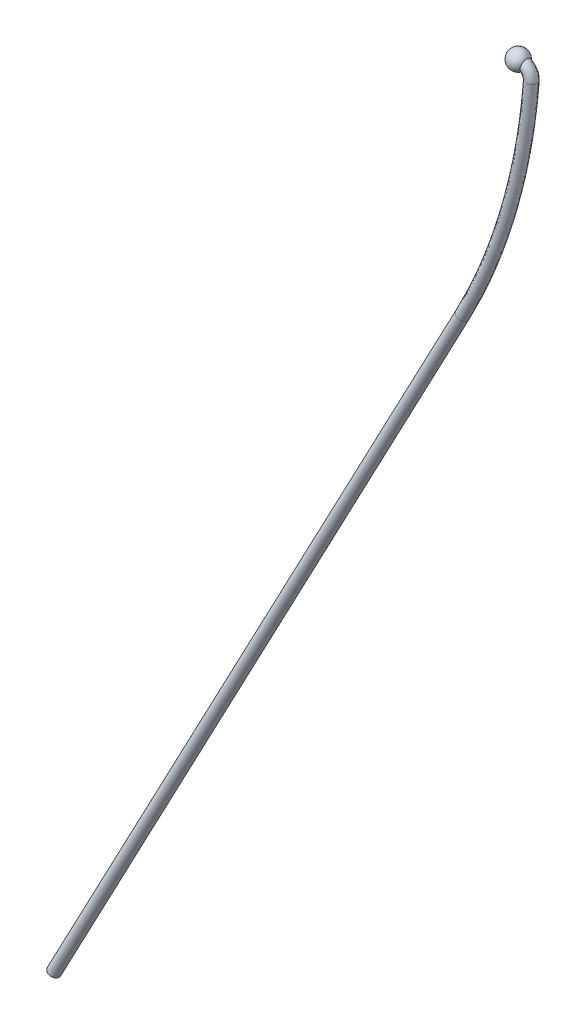
ISO-10303-21;
HEADER;
FILE_DESCRIPTION(('STEP AP214'),'2;1');
FILE_NAME('part.step','',(''),(''),'','','');
FILE_SCHEMA(('AUTOMOTIVE_DESIGN { 1 0 10303 214 1 1 1 1 }'));
ENDSEC;
DATA;
#1=APPLICATION_CONTEXT('core data for automotive mechanical design processes');
#2=APPLICATION_PROTOCOL_DEFINITION('international standard','automotive_design',2000,#1);
#3=PRODUCT_CONTEXT('',#1,'mechanical');
#4=PRODUCT('Part','Part','',(#3));
#5=PRODUCT_RELATED_PRODUCT_CATEGORY('part','',(#4));
#6=PRODUCT_DEFINITION_FORMATION('','',#4);
#7=PRODUCT_DEFINITION_CONTEXT('part definition',#1,'design');
#8=PRODUCT_DEFINITION('design','',#6,#7);
#9=PRODUCT_DEFINITION_SHAPE('','',#8);
#10=(LENGTH_UNIT() NAMED_UNIT(*) SI_UNIT(.MILLI.,.METRE.));
#11=(NAMED_UNIT(*) PLANE_ANGLE_UNIT() SI_UNIT($,.RADIAN.));
#12=(NAMED_UNIT(*) SI_UNIT($,.STERADIAN.) SOLID_ANGLE_UNIT());
#13=UNCERTAINTY_MEASURE_WITH_UNIT(LENGTH_MEASURE(1.E-05),#10,'distance_accuracy_value','');
#14=(GEOMETRIC_REPRESENTATION_CONTEXT(3) GLOBAL_UNCERTAINTY_ASSIGNED_CONTEXT((#13)) GLOBAL_UNIT_ASSIGNED_CONTEXT((#10,
#11,#12)) REPRESENTATION_CONTEXT('',''));
#15=CARTESIAN_POINT('',(0.,0.,0.));
#16=DIRECTION('',(0.,0.,1.));
#17=DIRECTION('',(1.,0.,0.));
#18=AXIS2_PLACEMENT_3D('',#15,#16,#17);
#19=CARTESIAN_POINT('',(0.05,0.,-0.15));
#20=CARTESIAN_POINT('',(0.070612126372054,0.,-0.15));
#21=CARTESIAN_POINT('',(0.111678763808335,-0.00475035948913755,-0.15));
#22=CARTESIAN_POINT('',(0.175583795185796,-0.025625995231415,-0.15));
#23=CARTESIAN_POINT('',(0.23587135332701,-0.061366755382337,-0.15));
#24=CARTESIAN_POINT('',(0.279562358160648,-0.103566966063429,-0.15));
#25=CARTESIAN_POINT('',(0.312746104509767,-0.153268833164525,-0.15));
#26=CARTESIAN_POINT('',(0.334121347331334,-0.201599537443067,-0.15));
#27=CARTESIAN_POINT('',(0.347195475968437,-0.252428746997234,-0.15));
#28=CARTESIAN_POINT('',(0.35,-0.283923021029257,-0.15));
#29=CARTESIAN_POINT('',(0.35,-0.3,-0.15));
#30=CARTESIAN_POINT('',(0.05,0.3,-0.15));
#31=CARTESIAN_POINT('',(0.0706121263720541,0.3,-0.15));
#32=CARTESIAN_POINT('',(0.190291027722327,0.289800577812004,-0.15));
#33=CARTESIAN_POINT('',(0.299307207087605,0.24874847259628,-0.15));
#34=CARTESIAN_POINT('',(0.423066964535489,0.177705420472651,-0.15));
#35=CARTESIAN_POINT('',(0.514818972912154,0.0861613070571044,-0.15));
#36=CARTESIAN_POINT('',(0.580923737307374,-0.0144263030527691,-0.15));
#37=CARTESIAN_POINT('',(0.621398278715104,-0.112817436820869,-0.15));
#38=CARTESIAN_POINT('',(0.646160259721789,-0.201732882702754,-0.15));
#39=CARTESIAN_POINT('',(0.65,-0.295398956019108,-0.15));
#40=CARTESIAN_POINT('',(0.65,-0.311475934989851,-0.15));
#41=CARTESIAN_POINT('',(0.05,0.3,0.15));
#42=CARTESIAN_POINT('',(0.0706121263720541,0.3,0.15));
#43=CARTESIAN_POINT('',(0.190291027722327,0.289800577812004,0.15));
#44=CARTESIAN_POINT('',(0.299307207087605,0.24874847259628,0.15));
#45=CARTESIAN_POINT('',(0.423066964535489,0.177705420472651,0.15));
#46=CARTESIAN_POINT('',(0.514818972912154,0.0861613070571044,0.15));
#47=CARTESIAN_POINT('',(0.580923737307374,-0.0144263030527691,0.15));
#48=CARTESIAN_POINT('',(0.621398278715104,-0.112817436820869,0.15));
#49=CARTESIAN_POINT('',(0.646160259721789,-0.201732882702754,0.15));
#50=CARTESIAN_POINT('',(0.65,-0.295398956019108,0.15));
#51=CARTESIAN_POINT('',(0.65,-0.311475934989851,0.15));
#52=CARTESIAN_POINT('',(0.05,0.,0.15));
#53=CARTESIAN_POINT('',(0.0706121263720541,0.,0.15));
#54=CARTESIAN_POINT('',(0.111678763808335,-0.00475035948913753,0.15));
#55=CARTESIAN_POINT('',(0.175583795185796,-0.0256259952314149,0.15));
#56=CARTESIAN_POINT('',(0.23587135332701,-0.0613667553823371,0.15));
#57=CARTESIAN_POINT('',(0.279562358160649,-0.103566966063429,0.15));
#58=CARTESIAN_POINT('',(0.312746104509767,-0.153268833164525,0.15));
#59=CARTESIAN_POINT('',(0.334121347331334,-0.201599537443067,0.15));
#60=CARTESIAN_POINT('',(0.347195475968437,-0.252428746997234,0.15));
#61=CARTESIAN_POINT('',(0.35,-0.283923021029257,0.15));
#62=CARTESIAN_POINT('',(0.35,-0.3,0.15));
#63=CARTESIAN_POINT('',(0.05,-0.3,0.15));
#64=CARTESIAN_POINT('',(0.070612126372054,-0.3,0.15));
#65=CARTESIAN_POINT('',(0.0330664998943435,-0.299301296790279,0.15));
#66=CARTESIAN_POINT('',(0.0518603832839872,-0.30000046305911,0.15));
#67=CARTESIAN_POINT('',(0.0486757421185307,-0.300438931237325,0.15));
#68=CARTESIAN_POINT('',(0.0443057434091437,-0.293295239183962,0.15));
#69=CARTESIAN_POINT('',(0.0445684717121609,-0.292111363276281,0.15));
#70=CARTESIAN_POINT('',(0.046844415947564,-0.290381638065265,0.15));
#71=CARTESIAN_POINT('',(0.0482306922150845,-0.303124611291713,0.15));
#72=CARTESIAN_POINT('',(0.0500000000000001,-0.272447086039406,0.15));
#73=CARTESIAN_POINT('',(0.0500000000000001,-0.288524065010149,0.15));
#74=CARTESIAN_POINT('',(0.05,-0.3,-0.15));
#75=CARTESIAN_POINT('',(0.070612126372054,-0.3,-0.15));
#76=CARTESIAN_POINT('',(0.0330664998943435,-0.299301296790279,-0.15));
#77=CARTESIAN_POINT('',(0.0518603832839872,-0.30000046305911,-0.15));
#78=CARTESIAN_POINT('',(0.0486757421185307,-0.300438931237325,-0.15));
#79=CARTESIAN_POINT('',(0.0443057434091437,-0.293295239183962,-0.15));
#80=CARTESIAN_POINT('',(0.0445684717121609,-0.292111363276281,-0.15));
#81=CARTESIAN_POINT('',(0.046844415947564,-0.290381638065265,-0.15));
#82=CARTESIAN_POINT('',(0.0482306922150845,-0.303124611291713,-0.15));
#83=CARTESIAN_POINT('',(0.0500000000000001,-0.272447086039406,-0.15));
#84=CARTESIAN_POINT('',(0.0500000000000001,-0.288524065010149,-0.15));
#85=CARTESIAN_POINT('',(0.05,0.,-0.15));
#86=CARTESIAN_POINT('',(0.070612126372054,0.,-0.15));
#87=CARTESIAN_POINT('',(0.111678763808335,-0.00475035948913755,-0.15));
#88=CARTESIAN_POINT('',(0.175583795185796,-0.025625995231415,-0.15));
#89=CARTESIAN_POINT('',(0.23587135332701,-0.061366755382337,-0.15));
#90=CARTESIAN_POINT('',(0.279562358160648,-0.103566966063429,-0.15));
#91=CARTESIAN_POINT('',(0.312746104509767,-0.153268833164525,-0.15));
#92=CARTESIAN_POINT('',(0.334121347331334,-0.201599537443067,-0.15));
#93=CARTESIAN_POINT('',(0.347195475968437,-0.252428746997234,-0.15));
#94=CARTESIAN_POINT('',(0.35,-0.283923021029257,-0.15));
#95=CARTESIAN_POINT('',(0.35,-0.3,-0.15));
#96=(BOUNDED_SURFACE() B_SPLINE_SURFACE(3,3,((#19,#20,#21,#22,#23,#24,#25,#26,#27,#28,#29),(#30,
#31,#32,#33,#34,#35,#36,#37,#38,#39,#40),(#41,#42,#43,#44,#45,#46,#47,#48,#49,#50,#51),(#52,#53,
#54,#55,#56,#57,#58,#59,#60,#61,#62),(#63,#64,#65,#66,#67,#68,#69,#70,#71,#72,#73),(#74,#75,#76,
#77,#78,#79,#80,#81,#82,#83,#84),(#85,#86,#87,#88,#89,#90,#91,#92,#93,#94,#95)),.UNSPECIFIED.,
.T.,.F.,.F.) B_SPLINE_SURFACE_WITH_KNOTS((4,3,4),(4,1,1,1,1,1,1,1,4),(0.,0.5,1.),(0.,
0.133901089613182,0.270695779625652,0.412547291728431,0.56377637646843,0.677576561676362,
0.787367057121807,0.89379756555187,1.),
.UNSPECIFIED.) GEOMETRIC_REPRESENTATION_ITEM() RATIONAL_B_SPLINE_SURFACE(((1.,1.,1.,1.,1.,1.,1.,
1.,1.,1.,1.),(0.333333333333333,0.333333333333333,0.333333333333334,0.333333333333333,
0.333333333333334,0.333333333333333,0.333333333333333,0.333333333333333,0.333333333333333,
0.333333333333333,0.333333333333333),(0.333333333333333,0.333333333333333,0.333333333333334,
0.333333333333333,0.333333333333334,0.333333333333333,0.333333333333333,0.333333333333333,
0.333333333333333,0.333333333333333,0.333333333333333),(1.,1.,1.,1.,1.,1.,1.,1.,1.,1.,1.),
(0.333333333333333,0.333333333333333,0.333333333333334,0.333333333333333,0.333333333333334,
0.333333333333333,0.333333333333333,0.333333333333333,0.333333333333333,0.333333333333333,
0.333333333333333),(0.333333333333333,0.333333333333333,0.333333333333334,0.333333333333333,
0.333333333333334,0.333333333333333,0.333333333333333,0.333333333333333,0.333333333333333,
0.333333333333333,0.333333333333333),(1.,1.,1.,1.,1.,1.,1.,1.,1.,1.,1.))) REPRESENTATION_ITEM('') SURFACE());
#97=CARTESIAN_POINT('',(0.196209649531552,-0.0387527215909466,-0.15));
#98=CARTESIAN_POINT('',(0.192610158822883,-0.0569716840393427,-0.149987281267136));
#99=CARTESIAN_POINT('',(0.188767840688836,-0.0752104187428228,-0.146810368722109));
#100=CARTESIAN_POINT('',(0.180948086791766,-0.109551183023133,-0.134567139338089));
#101=CARTESIAN_POINT('',(0.176970357554993,-0.12564814436129,-0.12548714202756));
#102=CARTESIAN_POINT('',(0.169466921402626,-0.153873282757319,-0.10221658797435));
#103=CARTESIAN_POINT('',(0.165940944050965,-0.166003841071902,-0.0880291083327406));
#104=CARTESIAN_POINT('',(0.161789696204247,-0.179561611129173,-0.0645116221969879));
#105=CARTESIAN_POINT('',(0.160612525721884,-0.183266814430272,-0.0565308536486733));
#106=CARTESIAN_POINT('',(0.158695687400933,-0.189191565149892,-0.0399938863186769));
#107=CARTESIAN_POINT('',(0.157954933015369,-0.191414804052597,-0.0314391762029283));
#108=CARTESIAN_POINT('',(0.157050676214533,-0.194112957172962,-0.0148256037830967));
#109=CARTESIAN_POINT('',(0.15684102446295,-0.19472780995727,-0.00679187311560768));
#110=CARTESIAN_POINT('',(0.156887524051654,-0.19458996667973,0.0092552351301373));
#111=CARTESIAN_POINT('',(0.157143539976832,-0.19383766818244,0.0172686179469376));
#112=CARTESIAN_POINT('',(0.158516191110306,-0.189735796527903,0.0399924693192685));
#113=CARTESIAN_POINT('',(0.160191980811877,-0.184682989674599,0.0543895763902141));
#114=CARTESIAN_POINT('',(0.164652199828413,-0.170281138983522,0.0815424213039328));
#115=CARTESIAN_POINT('',(0.167489467201309,-0.160723482904299,0.0941748164948794));
#116=CARTESIAN_POINT('',(0.173921816268022,-0.137385068186273,0.116944898987194));
#117=CARTESIAN_POINT('',(0.177561866168537,-0.123304192263076,0.126760557488894));
#118=CARTESIAN_POINT('',(0.18508044690239,-0.0918267465402,0.141959413615639));
#119=CARTESIAN_POINT('',(0.188959649946175,-0.0742778495773898,0.147026876983786));
#120=CARTESIAN_POINT('',(0.196425030741157,-0.038092054159478,0.151053213007837));
#121=CARTESIAN_POINT('',(0.200004983425206,-0.0194415914299598,0.149904968026665));
#122=CARTESIAN_POINT('',(0.20644845709116,0.0161132233899729,0.141273055169428));
#123=CARTESIAN_POINT('',(0.209323857217965,0.0330432240716428,0.133905354339318));
#124=CARTESIAN_POINT('',(0.214169488130775,0.0629542341727532,0.113961896392814));
#125=CARTESIAN_POINT('',(0.21616368191071,0.0760360536107423,0.101544372103161));
#126=CARTESIAN_POINT('',(0.219223130611246,0.096731833666152,0.0733555857900673));
#127=CARTESIAN_POINT('',(0.220318829218613,0.104523298956373,0.0577189205965566));
#128=CARTESIAN_POINT('',(0.221649477226201,0.114059152333074,0.025263630090405));
#129=CARTESIAN_POINT('',(0.221913613357304,0.116008469568781,0.00850670264185721));
#130=CARTESIAN_POINT('',(0.221662867168512,0.114185619099368,-0.0243400339542283));
#131=CARTESIAN_POINT('',(0.221163644380876,0.110528458665149,-0.0404364809675989));
#132=CARTESIAN_POINT('',(0.219419933843638,0.0981918990676106,-0.0705676861369477));
#133=CARTESIAN_POINT('',(0.21817316343593,0.08949712014299,-0.0845959649478891));
#134=CARTESIAN_POINT('',(0.214924297977232,0.0679294102042349,-0.109423806892059));
#135=CARTESIAN_POINT('',(0.212904506763113,0.0549596627553694,-0.120136189479965));
#136=CARTESIAN_POINT('',(0.208108754953098,0.0258695190527544,-0.137186007207907));
#137=CARTESIAN_POINT('',(0.205308457171723,0.00965347939882407,-0.143354307700277));
#138=CARTESIAN_POINT('',(0.200332578011847,-0.0174716018150883,-0.148934870098712));
#139=CARTESIAN_POINT('',(0.198312554255703,-0.0281087874061511,-0.150007430574375));
#140=CARTESIAN_POINT('',(0.196209649531552,-0.0387527215909466,-0.15));
#141=B_SPLINE_CURVE_WITH_KNOTS('',3,(#97,#98,#99,#100,#101,#102,#103,#104,#105,#106,#107,#108,
#109,#110,#111,#112,#113,#114,#115,#116,#117,#118,#119,#120,#121,#122,#123,#124,#125,#126,#127,
#128,#129,#130,#131,#132,#133,#134,#135,#136,#137,#138,#139,#140),.UNSPECIFIED.,.T.,.F.,(4,2,2,
2,2,2,2,2,2,2,2,2,2,2,2,2,2,2,2,2,2,4),(0.,0.0555801830550502,0.111289635257173,
0.166965580242578,0.19347282297353,0.219913788527817,0.243963338324473,0.268005895684496,
0.313209906225085,0.36075099269438,0.412522620387508,0.467533295449345,0.523494975653345,
0.578435678636951,0.631773325429137,0.683218871696011,0.732837379055482,0.781451581723809,
0.83021499068101,0.880168825000054,0.931899169011179,0.964370382017544),.UNSPECIFIED.);
#142=CARTESIAN_POINT('',(0.196209649531552,-0.0387527215909466,-0.15));
#143=VERTEX_POINT('',#142);
#144=EDGE_CURVE('E11',#143,#143,#141,.T.);
#145=CARTESIAN_POINT('',(0.35,-0.3,-0.15));
#146=CARTESIAN_POINT('',(0.0500000000000001,-0.288524065010149,-0.15));
#147=CARTESIAN_POINT('',(0.0500000000000001,-0.288524065010149,0.15));
#148=CARTESIAN_POINT('',(0.35,-0.3,0.15));
#149=CARTESIAN_POINT('',(0.65,-0.311475934989851,0.15));
#150=CARTESIAN_POINT('',(0.65,-0.311475934989851,-0.15));
#151=CARTESIAN_POINT('',(0.35,-0.3,-0.15));
#152=(BOUNDED_CURVE() B_SPLINE_CURVE(3,(#145,#146,#147,#148,#149,#150,#151),.UNSPECIFIED.,.T.,
.F.) B_SPLINE_CURVE_WITH_KNOTS((4,3,4),(0.,0.5,1.),
.UNSPECIFIED.) CURVE() GEOMETRIC_REPRESENTATION_ITEM() RATIONAL_B_SPLINE_CURVE((1.,
0.333333333333333,0.333333333333333,1.,0.333333333333333,0.333333333333333,1.)) REPRESENTATION_ITEM(''));
#153=CARTESIAN_POINT('',(0.35,-0.3,-0.15));
#154=VERTEX_POINT('',#153);
#155=EDGE_CURVE('E62',#154,#154,#152,.T.);
#156=ORIENTED_EDGE('',*,*,#144,.F.);
#157=EDGE_LOOP('',(#156));
#158=FACE_BOUND('',#157,.T.);
#159=ORIENTED_EDGE('',*,*,#155,.T.);
#160=EDGE_LOOP('',(#159));
#161=FACE_BOUND('',#160,.T.);
#162=ADVANCED_FACE('F45',(#158,#161),#96,.T.);
#163=CARTESIAN_POINT('',(-1.48489910288595,-6.65009658728105,0.));
#164=DIRECTION('',(-0.467198468352628,-0.884152470543943,0.));
#165=DIRECTION('',(0.884152470543943,-0.467198468352629,0.));
#166=AXIS2_PLACEMENT_3D('',#163,#164,#165);
#167=CYLINDRICAL_SURFACE('',#166,0.15);
#168=CARTESIAN_POINT('',(-1.48489910288595,-6.65009658728105,0.));
#169=DIRECTION('',(-0.467198468352629,-0.884152470543943,0.));
#170=DIRECTION('',(0.884152470543943,-0.467198468352629,0.));
#171=AXIS2_PLACEMENT_3D('',#168,#169,#170);
#172=CIRCLE('',#171,0.15);
#173=CARTESIAN_POINT('',(-1.35227623230436,-6.72017635753395,0.));
#174=VERTEX_POINT('',#173);
#175=EDGE_CURVE('E57',#174,#174,#172,.T.);
#176=ORIENTED_EDGE('',*,*,#175,.T.);
#177=EDGE_LOOP('',(#176));
#178=FACE_BOUND('',#177,.T.);
#179=CARTESIAN_POINT('',(-12.3939833389198,-27.2950567744821,0.));
#180=DIRECTION('',(-0.467198468352629,-0.884152470543943,0.));
#181=DIRECTION('',(0.884152470543943,-0.467198468352629,0.));
#182=AXIS2_PLACEMENT_3D('',#179,#180,#181);
#183=CIRCLE('',#182,0.15);
#184=CARTESIAN_POINT('',(-12.2613604683382,-27.365136544735,0.));
#185=VERTEX_POINT('',#184);
#186=EDGE_CURVE('E49',#185,#185,#183,.T.);
#187=ORIENTED_EDGE('',*,*,#186,.F.);
#188=EDGE_LOOP('',(#187));
#189=FACE_BOUND('',#188,.T.);
#190=ADVANCED_FACE('F47',(#178,#189),#167,.T.);
#191=CARTESIAN_POINT('',(-12.3939833389198,-27.2950567744821,0.15));
#192=DIRECTION('',(-0.467198468352628,-0.884152470543943,0.));
#193=DIRECTION('',(0.884152470543943,-0.467198468352628,0.));
#194=AXIS2_PLACEMENT_3D('',#191,#192,#193);
#195=PLANE('',#194);
#196=ORIENTED_EDGE('',*,*,#186,.T.);
#197=EDGE_LOOP('',(#196));
#198=FACE_BOUND('',#197,.T.);
#199=ADVANCED_FACE('F77',(#198),#195,.T.);
#200=CARTESIAN_POINT('',(0.35,-0.3,-0.15));
#201=CARTESIAN_POINT('',(0.302676632596426,-0.917650576415767,-0.15));
#202=CARTESIAN_POINT('',(0.134000791326066,-2.15157946941135,-0.15));
#203=CARTESIAN_POINT('',(-0.29397800302794,-3.83267812159043,-0.15));
#204=CARTESIAN_POINT('',(-0.842015894366938,-5.33586841241956,-0.15));
#205=CARTESIAN_POINT('',(-1.25764607891864,-6.22003027459009,-0.15));
#206=CARTESIAN_POINT('',(-1.48489910288595,-6.65009658728105,-0.15));
#207=CARTESIAN_POINT('',(0.0500000000000001,-0.288524065010149,-0.15));
#208=CARTESIAN_POINT('',(0.00267663259642644,-0.906174641425917,-0.15));
#209=CARTESIAN_POINT('',(-0.162775839502434,-2.09661855976979,-0.15));
#210=CARTESIAN_POINT('',(-0.582472344994634,-3.75030085167651,-0.15));
#211=CARTESIAN_POINT('',(-1.12278916715667,-5.22702605693542,-0.15));
#212=CARTESIAN_POINT('',(-1.52289182008182,-6.0798707340843,-0.15));
#213=CARTESIAN_POINT('',(-1.75014484404913,-6.50993704677526,-0.15));
#214=CARTESIAN_POINT('',(0.0500000000000001,-0.288524065010149,0.15));
#215=CARTESIAN_POINT('',(0.00267663259642644,-0.906174641425917,0.15));
#216=CARTESIAN_POINT('',(-0.162775839502434,-2.09661855976979,0.15));
#217=CARTESIAN_POINT('',(-0.582472344994634,-3.75030085167651,0.15));
#218=CARTESIAN_POINT('',(-1.12278916715667,-5.22702605693542,0.15));
#219=CARTESIAN_POINT('',(-1.52289182008182,-6.0798707340843,0.15));
#220=CARTESIAN_POINT('',(-1.75014484404913,-6.50993704677526,0.15));
#221=CARTESIAN_POINT('',(0.35,-0.3,0.15));
#222=CARTESIAN_POINT('',(0.302676632596426,-0.917650576415767,0.15));
#223=CARTESIAN_POINT('',(0.134000791326066,-2.15157946941135,0.15));
#224=CARTESIAN_POINT('',(-0.29397800302794,-3.83267812159043,0.15));
#225=CARTESIAN_POINT('',(-0.842015894366938,-5.33586841241956,0.15));
#226=CARTESIAN_POINT('',(-1.25764607891864,-6.22003027459009,0.15));
#227=CARTESIAN_POINT('',(-1.48489910288595,-6.65009658728105,0.15));
#228=CARTESIAN_POINT('',(0.65,-0.311475934989851,0.15));
#229=CARTESIAN_POINT('',(0.602676632596426,-0.929126511405618,0.15));
#230=CARTESIAN_POINT('',(0.430777422154565,-2.20654037905291,0.15));
#231=CARTESIAN_POINT('',(-0.0054836610612456,-3.91505539150435,0.15));
#232=CARTESIAN_POINT('',(-0.561242621577204,-5.4447107679037,0.15));
#233=CARTESIAN_POINT('',(-0.992400337755455,-6.36018981509587,0.15));
#234=CARTESIAN_POINT('',(-1.21965336172277,-6.79025612778684,0.15));
#235=CARTESIAN_POINT('',(0.65,-0.311475934989851,-0.15));
#236=CARTESIAN_POINT('',(0.602676632596426,-0.929126511405618,-0.15));
#237=CARTESIAN_POINT('',(0.430777422154565,-2.20654037905291,-0.15));
#238=CARTESIAN_POINT('',(-0.0054836610612456,-3.91505539150435,-0.15));
#239=CARTESIAN_POINT('',(-0.561242621577204,-5.4447107679037,-0.15));
#240=CARTESIAN_POINT('',(-0.992400337755455,-6.36018981509587,-0.15));
#241=CARTESIAN_POINT('',(-1.21965336172277,-6.79025612778684,-0.15));
#242=CARTESIAN_POINT('',(0.35,-0.3,-0.15));
#243=CARTESIAN_POINT('',(0.302676632596426,-0.917650576415767,-0.15));
#244=CARTESIAN_POINT('',(0.134000791326066,-2.15157946941135,-0.15));
#245=CARTESIAN_POINT('',(-0.29397800302794,-3.83267812159043,-0.15));
#246=CARTESIAN_POINT('',(-0.842015894366938,-5.33586841241956,-0.15));
#247=CARTESIAN_POINT('',(-1.25764607891864,-6.22003027459009,-0.15));
#248=CARTESIAN_POINT('',(-1.48489910288595,-6.65009658728105,-0.15));
#249=(BOUNDED_SURFACE() B_SPLINE_SURFACE(3,3,((#200,#201,#202,#203,#204,#205,#206),(#207,#208,
#209,#210,#211,#212,#213),(#214,#215,#216,#217,#218,#219,#220),(#221,#222,#223,#224,#225,#226,
#227),(#228,#229,#230,#231,#232,#233,#234),(#235,#236,#237,#238,#239,#240,#241),(#242,#243,#244,
#245,#246,#247,#248)),.UNSPECIFIED.,.T.,.F.,.F.) B_SPLINE_SURFACE_WITH_KNOTS((4,3,4),(4,1,1,1,
4),(0.,0.5,1.),(0.,0.279349729031747,0.56015724803879,0.780647490815451,1.),
.UNSPECIFIED.) GEOMETRIC_REPRESENTATION_ITEM() RATIONAL_B_SPLINE_SURFACE(((1.,1.,1.,1.,1.,1.,
1.),(0.333333333333333,0.333333333333333,0.333333333333333,0.333333333333333,0.333333333333333,
0.333333333333333,0.333333333333333),(0.333333333333333,0.333333333333333,0.333333333333333,
0.333333333333333,0.333333333333333,0.333333333333333,0.333333333333333),(1.,1.,1.,1.,1.,1.,1.),
(0.333333333333333,0.333333333333333,0.333333333333333,0.333333333333333,0.333333333333333,
0.333333333333333,0.333333333333333),(0.333333333333333,0.333333333333333,0.333333333333333,
0.333333333333333,0.333333333333333,0.333333333333333,0.333333333333333),(1.,1.,1.,1.,1.,1.,1.))) REPRESENTATION_ITEM('') SURFACE());
#250=ORIENTED_EDGE('',*,*,#155,.F.);
#251=EDGE_LOOP('',(#250));
#252=FACE_BOUND('',#251,.T.);
#253=ORIENTED_EDGE('',*,*,#175,.F.);
#254=EDGE_LOOP('',(#253));
#255=FACE_BOUND('',#254,.T.);
#256=ADVANCED_FACE('F73',(#252,#255),#249,.F.);
#257=CARTESIAN_POINT('',(0.,0.,0.));
#258=DIRECTION('',(0.,1.,0.));
#259=DIRECTION('',(0.,0.,1.));
#260=AXIS2_PLACEMENT_3D('',#257,#258,#259);
#261=SPHERICAL_SURFACE('',#260,0.25);
#262=ORIENTED_EDGE('',*,*,#144,.T.);
#263=EDGE_LOOP('',(#262));
#264=FACE_BOUND('',#263,.T.);
#265=ADVANCED_FACE('F69',(#264),#261,.T.);
#266=CLOSED_SHELL('',(#162,#190,#199,#256,#265));
#267=MANIFOLD_SOLID_BREP('B2',#266);
#268=ADVANCED_BREP_SHAPE_REPRESENTATION('',(#18,#267),#14);
#269=SHAPE_DEFINITION_REPRESENTATION(#9,#268);
ENDSEC;
END-ISO-10303-21;
